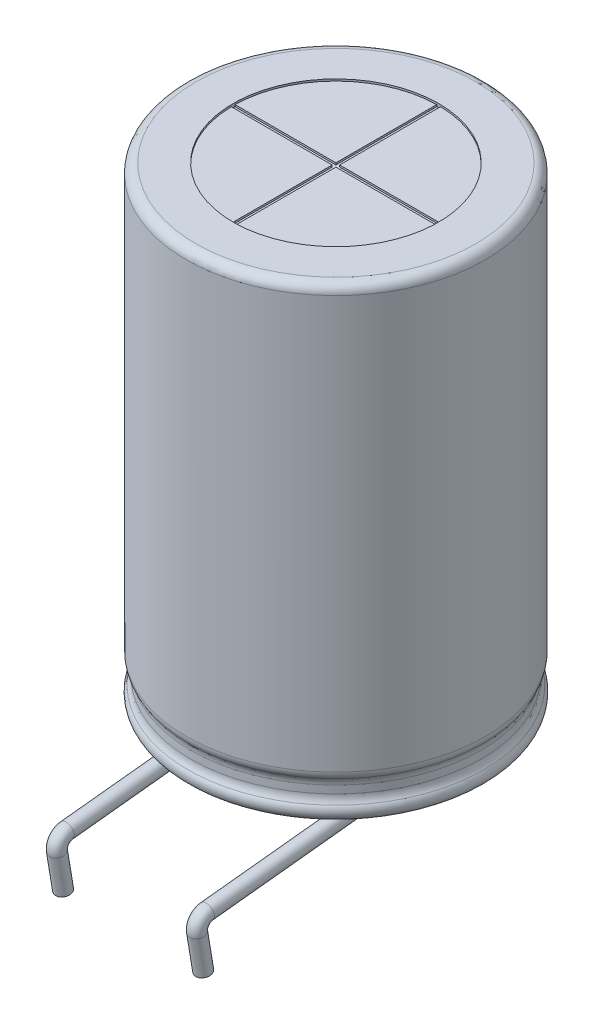
ISO-10303-21;
HEADER;
FILE_DESCRIPTION(('STEP AP214'),'2;1');
FILE_NAME('part.step','',(''),(''),'','','');
FILE_SCHEMA(('AUTOMOTIVE_DESIGN { 1 0 10303 214 1 1 1 1 }'));
ENDSEC;
DATA;
#1=APPLICATION_CONTEXT('core data for automotive mechanical design processes');
#2=APPLICATION_PROTOCOL_DEFINITION('international standard','automotive_design',2000,#1);
#3=PRODUCT_CONTEXT('',#1,'mechanical');
#4=PRODUCT('Part','Part','',(#3));
#5=PRODUCT_RELATED_PRODUCT_CATEGORY('part','',(#4));
#6=PRODUCT_DEFINITION_FORMATION('','',#4);
#7=PRODUCT_DEFINITION_CONTEXT('part definition',#1,'design');
#8=PRODUCT_DEFINITION('design','',#6,#7);
#9=PRODUCT_DEFINITION_SHAPE('','',#8);
#10=(LENGTH_UNIT() NAMED_UNIT(*) SI_UNIT(.MILLI.,.METRE.));
#11=(NAMED_UNIT(*) PLANE_ANGLE_UNIT() SI_UNIT($,.RADIAN.));
#12=(NAMED_UNIT(*) SI_UNIT($,.STERADIAN.) SOLID_ANGLE_UNIT());
#13=UNCERTAINTY_MEASURE_WITH_UNIT(LENGTH_MEASURE(1.E-05),#10,'distance_accuracy_value','');
#14=(GEOMETRIC_REPRESENTATION_CONTEXT(3) GLOBAL_UNCERTAINTY_ASSIGNED_CONTEXT((#13)) GLOBAL_UNIT_ASSIGNED_CONTEXT((#10,
#11,#12)) REPRESENTATION_CONTEXT('',''));
#15=CARTESIAN_POINT('',(0.,0.,0.));
#16=DIRECTION('',(0.,0.,1.));
#17=DIRECTION('',(1.,0.,0.));
#18=AXIS2_PLACEMENT_3D('',#15,#16,#17);
#19=CARTESIAN_POINT('',(0.,24.9,0.));
#20=DIRECTION('',(0.,-1.,0.));
#21=DIRECTION('',(0.,0.,-1.));
#22=AXIS2_PLACEMENT_3D('',#19,#20,#21);
#23=PLANE('',#22);
#24=CARTESIAN_POINT('',(0.,24.9,0.));
#25=DIRECTION('',(0.,1.,0.));
#26=DIRECTION('',(0.,0.,-1.));
#27=AXIS2_PLACEMENT_3D('',#24,#25,#26);
#28=CIRCLE('',#27,5.5);
#29=CARTESIAN_POINT('',(0.0999999999999808,24.9,5.499090833947));
#30=VERTEX_POINT('',#29);
#31=CARTESIAN_POINT('',(5.49909083394701,24.9,0.100000000000018));
#32=VERTEX_POINT('',#31);
#33=EDGE_CURVE('E153',#30,#32,#28,.T.);
#34=ORIENTED_EDGE('',*,*,#33,.T.);
#35=DIRECTION('',(1.,0.,0.));
#36=VECTOR('',#35,1.);
#37=CARTESIAN_POINT('',(0.100000000000001,24.9,0.0999999999999997));
#38=LINE('',#37,#36);
#39=CARTESIAN_POINT('',(0.100000000000001,24.9,0.0999999999999997));
#40=VERTEX_POINT('',#39);
#41=EDGE_CURVE('E197',#40,#32,#38,.T.);
#42=ORIENTED_EDGE('',*,*,#41,.F.);
#43=DIRECTION('',(0.,0.,-1.));
#44=VECTOR('',#43,1.);
#45=CARTESIAN_POINT('',(0.0999999999999823,24.9,5.499090833947));
#46=LINE('',#45,#44);
#47=EDGE_CURVE('E194',#30,#40,#46,.T.);
#48=ORIENTED_EDGE('',*,*,#47,.F.);
#49=EDGE_LOOP('',(#34,#42,#48));
#50=FACE_BOUND('',#49,.T.);
#51=ADVANCED_FACE('F41',(#50),#23,.F.);
#52=CARTESIAN_POINT('',(-5.499090833947,24.9,0.0999999999999632));
#53=VERTEX_POINT('',#52);
#54=CARTESIAN_POINT('',(-0.100000000000037,24.9,5.49909083394701));
#55=VERTEX_POINT('',#54);
#56=EDGE_CURVE('E235',#53,#55,#28,.T.);
#57=ORIENTED_EDGE('',*,*,#56,.T.);
#58=DIRECTION('',(0.,0.,1.));
#59=VECTOR('',#58,1.);
#60=CARTESIAN_POINT('',(-0.1,24.9,0.100000000000001));
#61=LINE('',#60,#59);
#62=CARTESIAN_POINT('',(-0.1,24.9,0.100000000000001));
#63=VERTEX_POINT('',#62);
#64=EDGE_CURVE('E190',#63,#55,#61,.T.);
#65=ORIENTED_EDGE('',*,*,#64,.F.);
#66=DIRECTION('',(1.,0.,0.));
#67=VECTOR('',#66,1.);
#68=CARTESIAN_POINT('',(-5.49909083394701,24.9,0.0999999999999631));
#69=LINE('',#68,#67);
#70=EDGE_CURVE('E186',#53,#63,#69,.T.);
#71=ORIENTED_EDGE('',*,*,#70,.F.);
#72=EDGE_LOOP('',(#57,#65,#71));
#73=FACE_BOUND('',#72,.T.);
#74=ADVANCED_FACE('F361',(#73),#23,.F.);
#75=CARTESIAN_POINT('',(-0.0999999999999423,24.9,-5.49909083394701));
#76=VERTEX_POINT('',#75);
#77=CARTESIAN_POINT('',(-5.49909083394701,24.9,-0.100000000000056));
#78=VERTEX_POINT('',#77);
#79=EDGE_CURVE('E230',#76,#78,#28,.T.);
#80=ORIENTED_EDGE('',*,*,#79,.T.);
#81=DIRECTION('',(-1.,0.,0.));
#82=VECTOR('',#81,1.);
#83=CARTESIAN_POINT('',(-0.1,24.9,-0.1));
#84=LINE('',#83,#82);
#85=CARTESIAN_POINT('',(-0.1,24.9,-0.1));
#86=VERTEX_POINT('',#85);
#87=EDGE_CURVE('E182',#86,#78,#84,.T.);
#88=ORIENTED_EDGE('',*,*,#87,.F.);
#89=DIRECTION('',(0.,0.,1.));
#90=VECTOR('',#89,1.);
#91=CARTESIAN_POINT('',(-0.0999999999999439,24.9,-5.49909083394701));
#92=LINE('',#91,#90);
#93=EDGE_CURVE('E178',#76,#86,#92,.T.);
#94=ORIENTED_EDGE('',*,*,#93,.F.);
#95=EDGE_LOOP('',(#80,#88,#94));
#96=FACE_BOUND('',#95,.T.);
#97=ADVANCED_FACE('F365',(#96),#23,.F.);
#98=CARTESIAN_POINT('',(0.,25.,0.));
#99=DIRECTION('',(0.,-1.,0.));
#100=DIRECTION('',(1.,0.,0.));
#101=AXIS2_PLACEMENT_3D('',#98,#99,#100);
#102=CYLINDRICAL_SURFACE('',#101,8.);
#103=CARTESIAN_POINT('',(0.,24.5,0.));
#104=DIRECTION('',(0.,1.,0.));
#105=DIRECTION('',(-1.,0.,0.));
#106=AXIS2_PLACEMENT_3D('',#103,#104,#105);
#107=CIRCLE('',#106,8.);
#108=CARTESIAN_POINT('',(-8.,24.5,0.));
#109=VERTEX_POINT('',#108);
#110=EDGE_CURVE('E255',#109,#109,#107,.F.);
#111=ORIENTED_EDGE('',*,*,#110,.T.);
#112=EDGE_LOOP('',(#111));
#113=FACE_BOUND('',#112,.T.);
#114=CARTESIAN_POINT('',(0.,2.40756880196224,0.));
#115=DIRECTION('',(0.,-1.,0.));
#116=DIRECTION('',(1.,0.,0.));
#117=AXIS2_PLACEMENT_3D('',#114,#115,#116);
#118=CIRCLE('',#117,8.);
#119=CARTESIAN_POINT('',(8.,2.40756880196224,0.));
#120=VERTEX_POINT('',#119);
#121=EDGE_CURVE('E234',#120,#120,#118,.T.);
#122=ORIENTED_EDGE('',*,*,#121,.F.);
#123=EDGE_LOOP('',(#122));
#124=FACE_BOUND('',#123,.T.);
#125=ADVANCED_FACE('F377',(#113,#124),#102,.T.);
#126=CARTESIAN_POINT('',(8.,25.,0.));
#127=DIRECTION('',(0.,1.,0.));
#128=DIRECTION('',(-1.,0.,0.));
#129=AXIS2_PLACEMENT_3D('',#126,#127,#128);
#130=PLANE('',#129);
#131=CARTESIAN_POINT('',(0.,25.,0.));
#132=DIRECTION('',(0.,1.,0.));
#133=DIRECTION('',(-1.,0.,0.));
#134=AXIS2_PLACEMENT_3D('',#131,#132,#133);
#135=CIRCLE('',#134,7.5);
#136=CARTESIAN_POINT('',(-7.5,25.,0.));
#137=VERTEX_POINT('',#136);
#138=EDGE_CURVE('E259',#137,#137,#135,.T.);
#139=ORIENTED_EDGE('',*,*,#138,.T.);
#140=EDGE_LOOP('',(#139));
#141=FACE_BOUND('',#140,.T.);
#142=CARTESIAN_POINT('',(0.,25.,0.));
#143=DIRECTION('',(0.,1.,0.));
#144=DIRECTION('',(0.,0.,-1.));
#145=AXIS2_PLACEMENT_3D('',#142,#143,#144);
#146=CIRCLE('',#145,5.5);
#147=CARTESIAN_POINT('',(0.,25.,-5.5));
#148=VERTEX_POINT('',#147);
#149=EDGE_CURVE('E202',#148,#148,#146,.T.);
#150=ORIENTED_EDGE('',*,*,#149,.F.);
#151=EDGE_LOOP('',(#150));
#152=FACE_BOUND('',#151,.T.);
#153=ADVANCED_FACE('F382',(#141,#152),#130,.T.);
#154=CARTESIAN_POINT('',(0.,0.,0.));
#155=DIRECTION('',(0.,-1.,0.));
#156=DIRECTION('',(1.,0.,0.));
#157=AXIS2_PLACEMENT_3D('',#154,#155,#156);
#158=PLANE('',#157);
#159=CARTESIAN_POINT('',(0.,0.,0.));
#160=DIRECTION('',(0.,-1.,0.));
#161=DIRECTION('',(1.,0.,0.));
#162=AXIS2_PLACEMENT_3D('',#159,#160,#161);
#163=CIRCLE('',#162,7.51793220524762);
#164=CARTESIAN_POINT('',(7.51793220524762,0.,0.));
#165=VERTEX_POINT('',#164);
#166=EDGE_CURVE('E263',#165,#165,#163,.T.);
#167=ORIENTED_EDGE('',*,*,#166,.T.);
#168=EDGE_LOOP('',(#167));
#169=FACE_BOUND('',#168,.T.);
#170=CARTESIAN_POINT('',(0.,0.,0.));
#171=DIRECTION('',(0.,-1.,0.));
#172=DIRECTION('',(1.,0.,0.));
#173=AXIS2_PLACEMENT_3D('',#170,#171,#172);
#174=CIRCLE('',#173,5.5);
#175=CARTESIAN_POINT('',(5.5,0.,0.));
#176=VERTEX_POINT('',#175);
#177=EDGE_CURVE('E287',#176,#176,#174,.T.);
#178=ORIENTED_EDGE('',*,*,#177,.F.);
#179=EDGE_LOOP('',(#178));
#180=FACE_BOUND('',#179,.T.);
#181=ADVANCED_FACE('F637',(#169,#180),#158,.T.);
#182=CARTESIAN_POINT('',(0.,1.23259900370742,0.));
#183=DIRECTION('',(0.,-1.,0.));
#184=DIRECTION('',(1.,0.,0.));
#185=AXIS2_PLACEMENT_3D('',#182,#183,#184);
#186=TOROIDAL_SURFACE('',#185,8.43125,0.670833333333331);
#187=CARTESIAN_POINT('',(0.,0.812853667063678,0.));
#188=DIRECTION('',(0.,1.,0.));
#189=DIRECTION('',(-1.,0.,0.));
#190=AXIS2_PLACEMENT_3D('',#187,#188,#189);
#191=CIRCLE('',#190,7.90796115674331);
#192=CARTESIAN_POINT('',(-7.90796115674331,0.812853667063677,0.));
#193=VERTEX_POINT('',#192);
#194=EDGE_CURVE('E267',#193,#193,#191,.T.);
#195=ORIENTED_EDGE('',*,*,#194,.T.);
#196=EDGE_LOOP('',(#195));
#197=FACE_BOUND('',#196,.T.);
#198=CARTESIAN_POINT('',(0.,1.23259900370742,0.));
#199=DIRECTION('',(0.,-1.,0.));
#200=DIRECTION('',(1.,0.,0.));
#201=AXIS2_PLACEMENT_3D('',#198,#199,#200);
#202=CIRCLE('',#201,7.76041666666666);
#203=CARTESIAN_POINT('',(7.76041666666666,1.23259900370742,0.));
#204=VERTEX_POINT('',#203);
#205=EDGE_CURVE('E251',#204,#204,#202,.T.);
#206=ORIENTED_EDGE('',*,*,#205,.T.);
#207=EDGE_LOOP('',(#206));
#208=FACE_BOUND('',#207,.T.);
#209=ADVANCED_FACE('F631',(#197,#208),#186,.F.);
#210=CARTESIAN_POINT('',(0.,25.,0.));
#211=DIRECTION('',(0.,-1.,0.));
#212=DIRECTION('',(1.,0.,0.));
#213=AXIS2_PLACEMENT_3D('',#210,#211,#212);
#214=CYLINDRICAL_SURFACE('',#213,7.76041666666666);
#215=CARTESIAN_POINT('',(0.,1.64240099629257,0.));
#216=DIRECTION('',(0.,-1.,0.));
#217=DIRECTION('',(1.,0.,0.));
#218=AXIS2_PLACEMENT_3D('',#215,#216,#217);
#219=CIRCLE('',#218,7.76041666666667);
#220=CARTESIAN_POINT('',(7.76041666666667,1.64240099629258,0.));
#221=VERTEX_POINT('',#220);
#222=EDGE_CURVE('E247',#221,#221,#219,.T.);
#223=ORIENTED_EDGE('',*,*,#222,.T.);
#224=EDGE_LOOP('',(#223));
#225=FACE_BOUND('',#224,.T.);
#226=ORIENTED_EDGE('',*,*,#205,.F.);
#227=EDGE_LOOP('',(#226));
#228=FACE_BOUND('',#227,.T.);
#229=ADVANCED_FACE('F636',(#225,#228),#214,.T.);
#230=CARTESIAN_POINT('',(0.,1.64240099629258,0.));
#231=DIRECTION('',(0.,-1.,0.));
#232=DIRECTION('',(1.,0.,0.));
#233=AXIS2_PLACEMENT_3D('',#230,#231,#232);
#234=TOROIDAL_SURFACE('',#233,8.43125,0.670833333333334);
#235=CARTESIAN_POINT('',(0.,2.02498489912741,0.));
#236=DIRECTION('',(0.,-1.,0.));
#237=DIRECTION('',(1.,0.,0.));
#238=AXIS2_PLACEMENT_3D('',#235,#236,#237);
#239=CIRCLE('',#238,7.88020833333333);
#240=CARTESIAN_POINT('',(7.88020833333333,2.02498489912741,0.));
#241=VERTEX_POINT('',#240);
#242=EDGE_CURVE('E243',#241,#241,#239,.T.);
#243=ORIENTED_EDGE('',*,*,#242,.T.);
#244=EDGE_LOOP('',(#243));
#245=FACE_BOUND('',#244,.T.);
#246=ORIENTED_EDGE('',*,*,#222,.F.);
#247=EDGE_LOOP('',(#246));
#248=FACE_BOUND('',#247,.T.);
#249=ADVANCED_FACE('F755',(#245,#248),#234,.F.);
#250=CARTESIAN_POINT('',(0.,2.40756880196224,0.));
#251=DIRECTION('',(0.,-1.,0.));
#252=DIRECTION('',(1.,0.,0.));
#253=AXIS2_PLACEMENT_3D('',#250,#251,#252);
#254=TOROIDAL_SURFACE('',#253,7.32916666666666,0.670833333333332);
#255=ORIENTED_EDGE('',*,*,#121,.T.);
#256=EDGE_LOOP('',(#255));
#257=FACE_BOUND('',#256,.T.);
#258=ORIENTED_EDGE('',*,*,#242,.F.);
#259=EDGE_LOOP('',(#258));
#260=FACE_BOUND('',#259,.T.);
#261=ADVANCED_FACE('F375',(#257,#260),#254,.T.);
#262=CARTESIAN_POINT('',(0.,24.9,0.));
#263=DIRECTION('',(0.,1.,0.));
#264=DIRECTION('',(0.,0.,1.));
#265=AXIS2_PLACEMENT_3D('',#262,#263,#264);
#266=CYLINDRICAL_SURFACE('',#265,5.5);
#267=ORIENTED_EDGE('',*,*,#79,.F.);
#268=DIRECTION('',(0.,1.,0.));
#269=VECTOR('',#268,1.);
#270=CARTESIAN_POINT('',(-0.0999999999999423,24.8,-5.49909083394701));
#271=LINE('',#270,#269);
#272=CARTESIAN_POINT('',(-0.0999999999999423,24.8,-5.49909083394701));
#273=VERTEX_POINT('',#272);
#274=EDGE_CURVE('E219',#273,#76,#271,.T.);
#275=ORIENTED_EDGE('',*,*,#274,.F.);
#276=CARTESIAN_POINT('',(0.,24.8,0.));
#277=DIRECTION('',(0.,1.,0.));
#278=DIRECTION('',(0.,0.,1.));
#279=AXIS2_PLACEMENT_3D('',#276,#277,#278);
#280=CIRCLE('',#279,5.5);
#281=CARTESIAN_POINT('',(0.0999999999999986,24.8,-5.49909083394701));
#282=VERTEX_POINT('',#281);
#283=EDGE_CURVE('E306',#282,#273,#280,.T.);
#284=ORIENTED_EDGE('',*,*,#283,.F.);
#285=DIRECTION('',(0.,1.,0.));
#286=VECTOR('',#285,1.);
#287=CARTESIAN_POINT('',(0.0999999999999986,24.8,-5.49909083394701));
#288=LINE('',#287,#286);
#289=CARTESIAN_POINT('',(0.0999999999999986,24.9,-5.49909083394701));
#290=VERTEX_POINT('',#289);
#291=EDGE_CURVE('E222',#282,#290,#288,.T.);
#292=ORIENTED_EDGE('',*,*,#291,.T.);
#293=CARTESIAN_POINT('',(5.499090833947,24.9,-0.100000000000002));
#294=VERTEX_POINT('',#293);
#295=EDGE_CURVE('E236',#294,#290,#28,.T.);
#296=ORIENTED_EDGE('',*,*,#295,.F.);
#297=DIRECTION('',(0.,1.,0.));
#298=VECTOR('',#297,1.);
#299=CARTESIAN_POINT('',(5.499090833947,24.8,-0.100000000000002));
#300=LINE('',#299,#298);
#301=CARTESIAN_POINT('',(5.499090833947,24.8,-0.100000000000002));
#302=VERTEX_POINT('',#301);
#303=EDGE_CURVE('E57',#302,#294,#300,.T.);
#304=ORIENTED_EDGE('',*,*,#303,.F.);
#305=CARTESIAN_POINT('',(0.,24.8,0.));
#306=DIRECTION('',(0.,1.,0.));
#307=DIRECTION('',(0.,0.,1.));
#308=AXIS2_PLACEMENT_3D('',#305,#306,#307);
#309=CIRCLE('',#308,5.5);
#310=CARTESIAN_POINT('',(5.49909083394701,24.8,0.100000000000018));
#311=VERTEX_POINT('',#310);
#312=EDGE_CURVE('E65',#311,#302,#309,.T.);
#313=ORIENTED_EDGE('',*,*,#312,.F.);
#314=DIRECTION('',(0.,1.,0.));
#315=VECTOR('',#314,1.);
#316=CARTESIAN_POINT('',(5.49909083394701,24.8,0.100000000000018));
#317=LINE('',#316,#315);
#318=EDGE_CURVE('E104',#311,#32,#317,.T.);
#319=ORIENTED_EDGE('',*,*,#318,.T.);
#320=ORIENTED_EDGE('',*,*,#33,.F.);
#321=DIRECTION('',(0.,1.,0.));
#322=VECTOR('',#321,1.);
#323=CARTESIAN_POINT('',(0.0999999999999808,24.8,5.499090833947));
#324=LINE('',#323,#322);
#325=CARTESIAN_POINT('',(0.0999999999999808,24.8,5.499090833947));
#326=VERTEX_POINT('',#325);
#327=EDGE_CURVE('E148',#326,#30,#324,.T.);
#328=ORIENTED_EDGE('',*,*,#327,.F.);
#329=CARTESIAN_POINT('',(0.,24.8,0.));
#330=DIRECTION('',(0.,1.,0.));
#331=DIRECTION('',(0.,0.,1.));
#332=AXIS2_PLACEMENT_3D('',#329,#330,#331);
#333=CIRCLE('',#332,5.5);
#334=CARTESIAN_POINT('',(-0.100000000000037,24.8,5.49909083394701));
#335=VERTEX_POINT('',#334);
#336=EDGE_CURVE('E137',#335,#326,#333,.T.);
#337=ORIENTED_EDGE('',*,*,#336,.F.);
#338=DIRECTION('',(0.,1.,0.));
#339=VECTOR('',#338,1.);
#340=CARTESIAN_POINT('',(-0.100000000000037,24.8,5.49909083394701));
#341=LINE('',#340,#339);
#342=EDGE_CURVE('E159',#335,#55,#341,.T.);
#343=ORIENTED_EDGE('',*,*,#342,.T.);
#344=ORIENTED_EDGE('',*,*,#56,.F.);
#345=DIRECTION('',(0.,1.,0.));
#346=VECTOR('',#345,1.);
#347=CARTESIAN_POINT('',(-5.499090833947,24.8,0.0999999999999632));
#348=LINE('',#347,#346);
#349=CARTESIAN_POINT('',(-5.499090833947,24.8,0.0999999999999632));
#350=VERTEX_POINT('',#349);
#351=EDGE_CURVE('E210',#350,#53,#348,.T.);
#352=ORIENTED_EDGE('',*,*,#351,.F.);
#353=CARTESIAN_POINT('',(0.,24.8,0.));
#354=DIRECTION('',(0.,1.,0.));
#355=DIRECTION('',(0.,0.,1.));
#356=AXIS2_PLACEMENT_3D('',#353,#354,#355);
#357=CIRCLE('',#356,5.49999999999999);
#358=CARTESIAN_POINT('',(-5.49909083394701,24.8,-0.100000000000056));
#359=VERTEX_POINT('',#358);
#360=EDGE_CURVE('E317',#359,#350,#357,.T.);
#361=ORIENTED_EDGE('',*,*,#360,.F.);
#362=DIRECTION('',(0.,1.,0.));
#363=VECTOR('',#362,1.);
#364=CARTESIAN_POINT('',(-5.49909083394701,24.8,-0.100000000000056));
#365=LINE('',#364,#363);
#366=EDGE_CURVE('E213',#359,#78,#365,.T.);
#367=ORIENTED_EDGE('',*,*,#366,.T.);
#368=EDGE_LOOP('',(#267,#275,#284,#292,#296,#304,#313,#319,#320,#328,#337,#343,#344,#352,#361,#367));
#369=FACE_BOUND('',#368,.T.);
#370=ORIENTED_EDGE('',*,*,#149,.T.);
#371=EDGE_LOOP('',(#370));
#372=FACE_BOUND('',#371,.T.);
#373=ADVANCED_FACE('F150',(#369,#372),#266,.F.);
#374=ORIENTED_EDGE('',*,*,#295,.T.);
#375=DIRECTION('',(0.,0.,-1.));
#376=VECTOR('',#375,1.);
#377=CARTESIAN_POINT('',(0.0999999999999994,24.9,-0.100000000000002));
#378=LINE('',#377,#376);
#379=CARTESIAN_POINT('',(0.0999999999999994,24.9,-0.100000000000002));
#380=VERTEX_POINT('',#379);
#381=EDGE_CURVE('E173',#380,#290,#378,.T.);
#382=ORIENTED_EDGE('',*,*,#381,.F.);
#383=DIRECTION('',(-1.,0.,0.));
#384=VECTOR('',#383,1.);
#385=CARTESIAN_POINT('',(5.499090833947,24.9,-0.100000000000002));
#386=LINE('',#385,#384);
#387=EDGE_CURVE('E170',#294,#380,#386,.T.);
#388=ORIENTED_EDGE('',*,*,#387,.F.);
#389=EDGE_LOOP('',(#374,#382,#388));
#390=FACE_BOUND('',#389,.T.);
#391=ADVANCED_FACE('F343',(#390),#23,.F.);
#392=CARTESIAN_POINT('',(0.100000000000001,24.8,0.0999999999999997));
#393=DIRECTION('',(0.,0.,1.));
#394=DIRECTION('',(1.,0.,0.));
#395=AXIS2_PLACEMENT_3D('',#392,#393,#394);
#396=PLANE('',#395);
#397=ORIENTED_EDGE('',*,*,#41,.T.);
#398=ORIENTED_EDGE('',*,*,#318,.F.);
#399=DIRECTION('',(1.,0.,0.));
#400=VECTOR('',#399,1.);
#401=CARTESIAN_POINT('',(0.100000000000001,24.8,0.0999999999999997));
#402=LINE('',#401,#400);
#403=CARTESIAN_POINT('',(0.100000000000001,24.8,0.0999999999999997));
#404=VERTEX_POINT('',#403);
#405=EDGE_CURVE('E164',#404,#311,#402,.T.);
#406=ORIENTED_EDGE('',*,*,#405,.F.);
#407=DIRECTION('',(0.,1.,0.));
#408=VECTOR('',#407,1.);
#409=CARTESIAN_POINT('',(0.100000000000001,24.8,0.0999999999999997));
#410=LINE('',#409,#408);
#411=EDGE_CURVE('E158',#404,#40,#410,.T.);
#412=ORIENTED_EDGE('',*,*,#411,.T.);
#413=EDGE_LOOP('',(#397,#398,#406,#412));
#414=FACE_BOUND('',#413,.T.);
#415=ADVANCED_FACE('F368',(#414),#396,.F.);
#416=CARTESIAN_POINT('',(0.0999999999999823,24.8,5.499090833947));
#417=DIRECTION('',(1.,0.,0.));
#418=DIRECTION('',(0.,0.,-1.));
#419=AXIS2_PLACEMENT_3D('',#416,#417,#418);
#420=PLANE('',#419);
#421=ORIENTED_EDGE('',*,*,#47,.T.);
#422=ORIENTED_EDGE('',*,*,#411,.F.);
#423=DIRECTION('',(0.,0.,-1.));
#424=VECTOR('',#423,1.);
#425=CARTESIAN_POINT('',(0.0999999999999823,24.8,5.499090833947));
#426=LINE('',#425,#424);
#427=EDGE_CURVE('E142',#326,#404,#426,.T.);
#428=ORIENTED_EDGE('',*,*,#427,.F.);
#429=ORIENTED_EDGE('',*,*,#327,.T.);
#430=EDGE_LOOP('',(#421,#422,#428,#429));
#431=FACE_BOUND('',#430,.T.);
#432=ADVANCED_FACE('F161',(#431),#420,.F.);
#433=CARTESIAN_POINT('',(-0.1,24.8,0.100000000000001));
#434=DIRECTION('',(-1.,0.,0.));
#435=DIRECTION('',(0.,0.,1.));
#436=AXIS2_PLACEMENT_3D('',#433,#434,#435);
#437=PLANE('',#436);
#438=ORIENTED_EDGE('',*,*,#64,.T.);
#439=ORIENTED_EDGE('',*,*,#342,.F.);
#440=DIRECTION('',(0.,0.,1.));
#441=VECTOR('',#440,1.);
#442=CARTESIAN_POINT('',(-0.1,24.8,0.100000000000001));
#443=LINE('',#442,#441);
#444=CARTESIAN_POINT('',(-0.1,24.8,0.100000000000001));
#445=VERTEX_POINT('',#444);
#446=EDGE_CURVE('E145',#445,#335,#443,.T.);
#447=ORIENTED_EDGE('',*,*,#446,.F.);
#448=DIRECTION('',(0.,1.,0.));
#449=VECTOR('',#448,1.);
#450=CARTESIAN_POINT('',(-0.1,24.8,0.100000000000001));
#451=LINE('',#450,#449);
#452=EDGE_CURVE('E207',#445,#63,#451,.T.);
#453=ORIENTED_EDGE('',*,*,#452,.T.);
#454=EDGE_LOOP('',(#438,#439,#447,#453));
#455=FACE_BOUND('',#454,.T.);
#456=ADVANCED_FACE('F331',(#455),#437,.F.);
#457=CARTESIAN_POINT('',(-5.49909083394701,24.8,0.0999999999999631));
#458=DIRECTION('',(0.,0.,1.));
#459=DIRECTION('',(1.,0.,0.));
#460=AXIS2_PLACEMENT_3D('',#457,#458,#459);
#461=PLANE('',#460);
#462=ORIENTED_EDGE('',*,*,#70,.T.);
#463=ORIENTED_EDGE('',*,*,#452,.F.);
#464=DIRECTION('',(1.,0.,0.));
#465=VECTOR('',#464,1.);
#466=CARTESIAN_POINT('',(-5.49909083394701,24.8,0.0999999999999631));
#467=LINE('',#466,#465);
#468=EDGE_CURVE('E320',#350,#445,#467,.T.);
#469=ORIENTED_EDGE('',*,*,#468,.F.);
#470=ORIENTED_EDGE('',*,*,#351,.T.);
#471=EDGE_LOOP('',(#462,#463,#469,#470));
#472=FACE_BOUND('',#471,.T.);
#473=ADVANCED_FACE('F327',(#472),#461,.F.);
#474=CARTESIAN_POINT('',(-0.1,24.8,-0.1));
#475=DIRECTION('',(0.,0.,-1.));
#476=DIRECTION('',(-1.,0.,0.));
#477=AXIS2_PLACEMENT_3D('',#474,#475,#476);
#478=PLANE('',#477);
#479=ORIENTED_EDGE('',*,*,#87,.T.);
#480=ORIENTED_EDGE('',*,*,#366,.F.);
#481=DIRECTION('',(-1.,0.,0.));
#482=VECTOR('',#481,1.);
#483=CARTESIAN_POINT('',(-0.1,24.8,-0.1));
#484=LINE('',#483,#482);
#485=CARTESIAN_POINT('',(-0.1,24.8,-0.1));
#486=VERTEX_POINT('',#485);
#487=EDGE_CURVE('E313',#486,#359,#484,.T.);
#488=ORIENTED_EDGE('',*,*,#487,.F.);
#489=DIRECTION('',(0.,1.,0.));
#490=VECTOR('',#489,1.);
#491=CARTESIAN_POINT('',(-0.1,24.8,-0.1));
#492=LINE('',#491,#490);
#493=EDGE_CURVE('E216',#486,#86,#492,.T.);
#494=ORIENTED_EDGE('',*,*,#493,.T.);
#495=EDGE_LOOP('',(#479,#480,#488,#494));
#496=FACE_BOUND('',#495,.T.);
#497=ADVANCED_FACE('F390',(#496),#478,.F.);
#498=CARTESIAN_POINT('',(-0.0999999999999439,24.8,-5.49909083394701));
#499=DIRECTION('',(-1.,0.,0.));
#500=DIRECTION('',(0.,0.,1.));
#501=AXIS2_PLACEMENT_3D('',#498,#499,#500);
#502=PLANE('',#501);
#503=ORIENTED_EDGE('',*,*,#93,.T.);
#504=ORIENTED_EDGE('',*,*,#493,.F.);
#505=DIRECTION('',(0.,0.,1.));
#506=VECTOR('',#505,1.);
#507=CARTESIAN_POINT('',(-0.0999999999999439,24.8,-5.49909083394701));
#508=LINE('',#507,#506);
#509=EDGE_CURVE('E309',#273,#486,#508,.T.);
#510=ORIENTED_EDGE('',*,*,#509,.F.);
#511=ORIENTED_EDGE('',*,*,#274,.T.);
#512=EDGE_LOOP('',(#503,#504,#510,#511));
#513=FACE_BOUND('',#512,.T.);
#514=ADVANCED_FACE('F357',(#513),#502,.F.);
#515=CARTESIAN_POINT('',(0.0999999999999994,24.8,-0.100000000000002));
#516=DIRECTION('',(1.,0.,0.));
#517=DIRECTION('',(0.,0.,-1.));
#518=AXIS2_PLACEMENT_3D('',#515,#516,#517);
#519=PLANE('',#518);
#520=ORIENTED_EDGE('',*,*,#381,.T.);
#521=ORIENTED_EDGE('',*,*,#291,.F.);
#522=DIRECTION('',(0.,0.,-1.));
#523=VECTOR('',#522,1.);
#524=CARTESIAN_POINT('',(0.0999999999999994,24.8,-0.100000000000002));
#525=LINE('',#524,#523);
#526=CARTESIAN_POINT('',(0.0999999999999994,24.8,-0.100000000000002));
#527=VERTEX_POINT('',#526);
#528=EDGE_CURVE('E302',#527,#282,#525,.T.);
#529=ORIENTED_EDGE('',*,*,#528,.F.);
#530=DIRECTION('',(0.,1.,0.));
#531=VECTOR('',#530,1.);
#532=CARTESIAN_POINT('',(0.0999999999999994,24.8,-0.100000000000002));
#533=LINE('',#532,#531);
#534=EDGE_CURVE('E225',#527,#380,#533,.T.);
#535=ORIENTED_EDGE('',*,*,#534,.T.);
#536=EDGE_LOOP('',(#520,#521,#529,#535));
#537=FACE_BOUND('',#536,.T.);
#538=ADVANCED_FACE('F348',(#537),#519,.F.);
#539=CARTESIAN_POINT('',(5.499090833947,24.8,-0.100000000000002));
#540=DIRECTION('',(0.,0.,-1.));
#541=DIRECTION('',(-1.,0.,0.));
#542=AXIS2_PLACEMENT_3D('',#539,#540,#541);
#543=PLANE('',#542);
#544=ORIENTED_EDGE('',*,*,#387,.T.);
#545=ORIENTED_EDGE('',*,*,#534,.F.);
#546=DIRECTION('',(-1.,0.,0.));
#547=VECTOR('',#546,1.);
#548=CARTESIAN_POINT('',(5.499090833947,24.8,-0.100000000000002));
#549=LINE('',#548,#547);
#550=EDGE_CURVE('E298',#302,#527,#549,.T.);
#551=ORIENTED_EDGE('',*,*,#550,.F.);
#552=ORIENTED_EDGE('',*,*,#303,.T.);
#553=EDGE_LOOP('',(#544,#545,#551,#552));
#554=FACE_BOUND('',#553,.T.);
#555=ADVANCED_FACE('F349',(#554),#543,.F.);
#556=CARTESIAN_POINT('',(0.,24.8,0.));
#557=DIRECTION('',(0.,1.,0.));
#558=DIRECTION('',(0.,0.,1.));
#559=AXIS2_PLACEMENT_3D('',#556,#557,#558);
#560=PLANE('',#559);
#561=ORIENTED_EDGE('',*,*,#312,.T.);
#562=ORIENTED_EDGE('',*,*,#550,.T.);
#563=ORIENTED_EDGE('',*,*,#528,.T.);
#564=ORIENTED_EDGE('',*,*,#283,.T.);
#565=ORIENTED_EDGE('',*,*,#509,.T.);
#566=ORIENTED_EDGE('',*,*,#487,.T.);
#567=ORIENTED_EDGE('',*,*,#360,.T.);
#568=ORIENTED_EDGE('',*,*,#468,.T.);
#569=ORIENTED_EDGE('',*,*,#446,.T.);
#570=ORIENTED_EDGE('',*,*,#336,.T.);
#571=ORIENTED_EDGE('',*,*,#427,.T.);
#572=ORIENTED_EDGE('',*,*,#405,.T.);
#573=EDGE_LOOP('',(#561,#562,#563,#564,#565,#566,#567,#568,#569,#570,#571,#572));
#574=FACE_BOUND('',#573,.T.);
#575=ADVANCED_FACE('F139',(#574),#560,.T.);
#576=CARTESIAN_POINT('',(0.,0.25,0.));
#577=DIRECTION('',(0.,-1.,0.));
#578=DIRECTION('',(1.,0.,0.));
#579=AXIS2_PLACEMENT_3D('',#576,#577,#578);
#580=CYLINDRICAL_SURFACE('',#579,5.5);
#581=CARTESIAN_POINT('',(0.,0.25,0.));
#582=DIRECTION('',(0.,-1.,0.));
#583=DIRECTION('',(1.,0.,0.));
#584=AXIS2_PLACEMENT_3D('',#581,#582,#583);
#585=CIRCLE('',#584,5.5);
#586=CARTESIAN_POINT('',(5.5,0.250000000000001,0.));
#587=VERTEX_POINT('',#586);
#588=EDGE_CURVE('E174',#587,#587,#585,.T.);
#589=ORIENTED_EDGE('',*,*,#588,.F.);
#590=EDGE_LOOP('',(#589));
#591=FACE_BOUND('',#590,.T.);
#592=ORIENTED_EDGE('',*,*,#177,.T.);
#593=EDGE_LOOP('',(#592));
#594=FACE_BOUND('',#593,.T.);
#595=ADVANCED_FACE('F280',(#591,#594),#580,.F.);
#596=CARTESIAN_POINT('',(0.,0.25,0.));
#597=DIRECTION('',(0.,-1.,0.));
#598=DIRECTION('',(1.,0.,0.));
#599=AXIS2_PLACEMENT_3D('',#596,#597,#598);
#600=PLANE('',#599);
#601=CARTESIAN_POINT('',(-3.75,0.25,0.));
#602=DIRECTION('',(0.,-1.,0.));
#603=DIRECTION('',(1.,0.,0.));
#604=AXIS2_PLACEMENT_3D('',#601,#602,#603);
#605=CIRCLE('',#604,0.4);
#606=CARTESIAN_POINT('',(-3.35,0.25,0.));
#607=VERTEX_POINT('',#606);
#608=EDGE_CURVE('E11',#607,#607,#605,.T.);
#609=ORIENTED_EDGE('',*,*,#608,.F.);
#610=EDGE_LOOP('',(#609));
#611=FACE_BOUND('',#610,.T.);
#612=CARTESIAN_POINT('',(3.75,0.25,0.));
#613=DIRECTION('',(0.,-1.,0.));
#614=DIRECTION('',(1.,0.,0.));
#615=AXIS2_PLACEMENT_3D('',#612,#613,#614);
#616=CIRCLE('',#615,0.4);
#617=CARTESIAN_POINT('',(4.15,0.25,0.));
#618=VERTEX_POINT('',#617);
#619=EDGE_CURVE('E50',#618,#618,#616,.T.);
#620=ORIENTED_EDGE('',*,*,#619,.F.);
#621=EDGE_LOOP('',(#620));
#622=FACE_BOUND('',#621,.T.);
#623=ORIENTED_EDGE('',*,*,#588,.T.);
#624=EDGE_LOOP('',(#623));
#625=FACE_BOUND('',#624,.T.);
#626=ADVANCED_FACE('F276',(#611,#622,#625),#600,.T.);
#627=CARTESIAN_POINT('',(0.,24.5,0.));
#628=DIRECTION('',(0.,1.,0.));
#629=DIRECTION('',(-1.,0.,0.));
#630=AXIS2_PLACEMENT_3D('',#627,#628,#629);
#631=TOROIDAL_SURFACE('',#630,7.5,0.5);
#632=ORIENTED_EDGE('',*,*,#138,.F.);
#633=EDGE_LOOP('',(#632));
#634=FACE_BOUND('',#633,.T.);
#635=ORIENTED_EDGE('',*,*,#110,.F.);
#636=EDGE_LOOP('',(#635));
#637=FACE_BOUND('',#636,.T.);
#638=ADVANCED_FACE('F279',(#634,#637),#631,.T.);
#639=CARTESIAN_POINT('',(0.,0.499999999999999,0.));
#640=DIRECTION('',(0.,1.,0.));
#641=DIRECTION('',(-1.,0.,0.));
#642=AXIS2_PLACEMENT_3D('',#639,#640,#641);
#643=TOROIDAL_SURFACE('',#642,7.51793220524762,0.5);
#644=ORIENTED_EDGE('',*,*,#194,.F.);
#645=EDGE_LOOP('',(#644));
#646=FACE_BOUND('',#645,.T.);
#647=ORIENTED_EDGE('',*,*,#166,.F.);
#648=EDGE_LOOP('',(#647));
#649=FACE_BOUND('',#648,.T.);
#650=ADVANCED_FACE('F43',(#646,#649),#643,.T.);
#651=CARTESIAN_POINT('',(3.75,-5.15616277952463,10.8508698919982));
#652=DIRECTION('',(0.,-0.986438339744518,-0.164132269472154));
#653=DIRECTION('',(1.,0.,0.));
#654=AXIS2_PLACEMENT_3D('',#651,#652,#653);
#655=PLANE('',#654);
#656=CARTESIAN_POINT('',(3.75,-5.15616277952463,10.8508698919982));
#657=DIRECTION('',(0.,-0.986438339744518,-0.164132269472154));
#658=DIRECTION('',(1.,0.,0.));
#659=AXIS2_PLACEMENT_3D('',#656,#657,#658);
#660=CIRCLE('',#659,0.4);
#661=CARTESIAN_POINT('',(4.15,-5.15616277952463,10.8508698919982));
#662=VERTEX_POINT('',#661);
#663=EDGE_CURVE('E291',#662,#662,#660,.T.);
#664=ORIENTED_EDGE('',*,*,#663,.T.);
#665=EDGE_LOOP('',(#664));
#666=FACE_BOUND('',#665,.T.);
#667=ADVANCED_FACE('F407',(#666),#655,.T.);
#668=CARTESIAN_POINT('',(3.75,0.25,0.));
#669=DIRECTION('',(0.,-1.,0.));
#670=DIRECTION('',(0.,0.,-1.));
#671=AXIS2_PLACEMENT_3D('',#668,#669,#670);
#672=CYLINDRICAL_SURFACE('',#671,0.4);
#673=CARTESIAN_POINT('',(3.75,0.,0.));
#674=DIRECTION('',(0.,-1.,0.));
#675=DIRECTION('',(1.,0.,0.));
#676=AXIS2_PLACEMENT_3D('',#673,#674,#675);
#677=CIRCLE('',#676,0.4);
#678=CARTESIAN_POINT('',(3.75,0.,-0.400000000000003));
#679=VERTEX_POINT('',#678);
#680=EDGE_CURVE('E480',#679,#679,#677,.T.);
#681=ORIENTED_EDGE('',*,*,#680,.F.);
#682=EDGE_LOOP('',(#681));
#683=FACE_BOUND('',#682,.T.);
#684=ORIENTED_EDGE('',*,*,#619,.T.);
#685=EDGE_LOOP('',(#684));
#686=FACE_BOUND('',#685,.T.);
#687=ADVANCED_FACE('F274',(#683,#686),#672,.T.);
#688=CARTESIAN_POINT('',(3.75,0.,1.5));
#689=DIRECTION('',(-1.,0.,0.));
#690=DIRECTION('',(0.,0.,1.));
#691=AXIS2_PLACEMENT_3D('',#688,#689,#690);
#692=TOROIDAL_SURFACE('',#691,1.5,0.4);
#693=CARTESIAN_POINT('',(3.75,-1.4914781249483,1.34033471635729));
#694=DIRECTION('',(0.,-0.10644352242847,0.994318749965533));
#695=DIRECTION('',(1.,0.,0.));
#696=AXIS2_PLACEMENT_3D('',#693,#694,#695);
#697=CIRCLE('',#696,0.4);
#698=CARTESIAN_POINT('',(3.75,-1.88920562493452,1.29775730738591));
#699=VERTEX_POINT('',#698);
#700=EDGE_CURVE('E484',#699,#699,#697,.T.);
#701=CARTESIAN_POINT('',(3.75,0.,1.5));
#702=DIRECTION('',(-1.,0.,0.));
#703=DIRECTION('',(0.,0.,1.));
#704=AXIS2_PLACEMENT_3D('',#701,#702,#703);
#705=CIRCLE('',#704,1.9);
#706=EDGE_CURVE('',#679,#699,#705,.T.);
#707=ORIENTED_EDGE('',*,*,#680,.T.);
#708=ORIENTED_EDGE('',*,*,#700,.F.);
#709=ORIENTED_EDGE('',*,*,#706,.T.);
#710=ORIENTED_EDGE('',*,*,#706,.F.);
#711=EDGE_LOOP('',(#707,#709,#708,#710));
#712=FACE_BOUND('',#711,.T.);
#713=ADVANCED_FACE('F424',(#712),#692,.T.);
#714=CARTESIAN_POINT('',(3.75,-1.4914781249483,1.34033471635729));
#715=DIRECTION('',(0.,-0.106443522428474,0.994318749965532));
#716=DIRECTION('',(0.,-0.994318749965532,-0.106443522428474));
#717=AXIS2_PLACEMENT_3D('',#714,#715,#716);
#718=CYLINDRICAL_SURFACE('',#717,0.4);
#719=CARTESIAN_POINT('',(3.75,-2.48821548837298,10.6511375405529));
#720=DIRECTION('',(0.,-0.106443522428474,0.994318749965532));
#721=DIRECTION('',(1.,0.,0.));
#722=AXIS2_PLACEMENT_3D('',#719,#720,#721);
#723=CIRCLE('',#722,0.4);
#724=CARTESIAN_POINT('',(3.75,-2.09048798838677,10.6937149495243));
#725=VERTEX_POINT('',#724);
#726=EDGE_CURVE('E488',#725,#725,#723,.T.);
#727=ORIENTED_EDGE('',*,*,#726,.F.);
#728=EDGE_LOOP('',(#727));
#729=FACE_BOUND('',#728,.T.);
#730=ORIENTED_EDGE('',*,*,#700,.T.);
#731=EDGE_LOOP('',(#730));
#732=FACE_BOUND('',#731,.T.);
#733=ADVANCED_FACE('F420',(#729,#732),#718,.T.);
#734=CARTESIAN_POINT('',(3.75,-3.0848067383523,10.5872714270958));
#735=DIRECTION('',(1.,0.,0.));
#736=DIRECTION('',(0.,0.,-1.));
#737=AXIS2_PLACEMENT_3D('',#734,#735,#736);
#738=TOROIDAL_SURFACE('',#737,0.600000000000001,0.4);
#739=CARTESIAN_POINT('',(3.75,-3.18328610003559,11.1791344309425));
#740=DIRECTION('',(0.,-0.986438339744518,-0.164132269472153));
#741=DIRECTION('',(1.,0.,0.));
#742=AXIS2_PLACEMENT_3D('',#739,#740,#741);
#743=CIRCLE('',#742,0.4);
#744=CARTESIAN_POINT('',(3.75,-3.24893900782446,11.5737097668404));
#745=VERTEX_POINT('',#744);
#746=EDGE_CURVE('E491',#745,#745,#743,.T.);
#747=CARTESIAN_POINT('',(3.75,-3.0848067383523,10.5872714270958));
#748=DIRECTION('',(1.,0.,0.));
#749=DIRECTION('',(0.,0.,-1.));
#750=AXIS2_PLACEMENT_3D('',#747,#748,#749);
#751=CIRCLE('',#750,1.);
#752=EDGE_CURVE('',#725,#745,#751,.T.);
#753=ORIENTED_EDGE('',*,*,#726,.T.);
#754=ORIENTED_EDGE('',*,*,#746,.F.);
#755=ORIENTED_EDGE('',*,*,#752,.T.);
#756=ORIENTED_EDGE('',*,*,#752,.F.);
#757=EDGE_LOOP('',(#753,#755,#754,#756));
#758=FACE_BOUND('',#757,.T.);
#759=ADVANCED_FACE('F416',(#758),#738,.T.);
#760=CARTESIAN_POINT('',(3.75,-3.18328610003559,11.1791344309425));
#761=DIRECTION('',(0.,-0.986438339744518,-0.164132269472154));
#762=DIRECTION('',(0.,0.164132269472154,-0.986438339744518));
#763=AXIS2_PLACEMENT_3D('',#760,#761,#762);
#764=CYLINDRICAL_SURFACE('',#763,0.4);
#765=ORIENTED_EDGE('',*,*,#663,.F.);
#766=EDGE_LOOP('',(#765));
#767=FACE_BOUND('',#766,.T.);
#768=ORIENTED_EDGE('',*,*,#746,.T.);
#769=EDGE_LOOP('',(#768));
#770=FACE_BOUND('',#769,.T.);
#771=ADVANCED_FACE('F412',(#767,#770),#764,.T.);
#772=CARTESIAN_POINT('',(-3.75,-5.15616277952463,10.8508698919982));
#773=DIRECTION('',(0.,-0.986438339744518,-0.164132269472154));
#774=DIRECTION('',(-1.,0.,0.));
#775=AXIS2_PLACEMENT_3D('',#772,#773,#774);
#776=PLANE('',#775);
#777=CARTESIAN_POINT('',(-3.75,-5.15616277952463,10.8508698919982));
#778=DIRECTION('',(0.,0.986438339744518,0.164132269472154));
#779=DIRECTION('',(-1.,0.,0.));
#780=AXIS2_PLACEMENT_3D('',#777,#778,#779);
#781=CIRCLE('',#780,0.4);
#782=CARTESIAN_POINT('',(-4.15,-5.15616277952463,10.8508698919982));
#783=VERTEX_POINT('',#782);
#784=EDGE_CURVE('E476',#783,#783,#781,.F.);
#785=ORIENTED_EDGE('',*,*,#784,.T.);
#786=EDGE_LOOP('',(#785));
#787=FACE_BOUND('',#786,.T.);
#788=ADVANCED_FACE('F415',(#787),#776,.T.);
#789=CARTESIAN_POINT('',(-3.75,0.25,0.));
#790=DIRECTION('',(0.,-1.,0.));
#791=DIRECTION('',(0.,0.,-1.));
#792=AXIS2_PLACEMENT_3D('',#789,#790,#791);
#793=CYLINDRICAL_SURFACE('',#792,0.4);
#794=CARTESIAN_POINT('',(-3.75,0.,0.));
#795=DIRECTION('',(0.,1.,0.));
#796=DIRECTION('',(-1.,0.,0.));
#797=AXIS2_PLACEMENT_3D('',#794,#795,#796);
#798=CIRCLE('',#797,0.4);
#799=CARTESIAN_POINT('',(-3.75,0.,-0.400000000000003));
#800=VERTEX_POINT('',#799);
#801=EDGE_CURVE('E458',#800,#800,#798,.F.);
#802=ORIENTED_EDGE('',*,*,#801,.F.);
#803=EDGE_LOOP('',(#802));
#804=FACE_BOUND('',#803,.T.);
#805=ORIENTED_EDGE('',*,*,#608,.T.);
#806=EDGE_LOOP('',(#805));
#807=FACE_BOUND('',#806,.T.);
#808=ADVANCED_FACE('F434',(#804,#807),#793,.T.);
#809=CARTESIAN_POINT('',(-3.75,0.,1.5));
#810=DIRECTION('',(-1.,0.,0.));
#811=DIRECTION('',(0.,0.,1.));
#812=AXIS2_PLACEMENT_3D('',#809,#810,#811);
#813=TOROIDAL_SURFACE('',#812,1.5,0.4);
#814=CARTESIAN_POINT('',(-3.75,-1.4914781249483,1.34033471635729));
#815=DIRECTION('',(0.,0.10644352242847,-0.994318749965533));
#816=DIRECTION('',(-1.,0.,0.));
#817=AXIS2_PLACEMENT_3D('',#814,#815,#816);
#818=CIRCLE('',#817,0.4);
#819=CARTESIAN_POINT('',(-3.75,-1.88920562493452,1.29775730738591));
#820=VERTEX_POINT('',#819);
#821=EDGE_CURVE('E462',#820,#820,#818,.F.);
#822=CARTESIAN_POINT('',(-3.75,0.,1.5));
#823=DIRECTION('',(-1.,0.,0.));
#824=DIRECTION('',(0.,0.,1.));
#825=AXIS2_PLACEMENT_3D('',#822,#823,#824);
#826=CIRCLE('',#825,1.9);
#827=EDGE_CURVE('',#800,#820,#826,.T.);
#828=ORIENTED_EDGE('',*,*,#801,.T.);
#829=ORIENTED_EDGE('',*,*,#821,.F.);
#830=ORIENTED_EDGE('',*,*,#827,.T.);
#831=ORIENTED_EDGE('',*,*,#827,.F.);
#832=EDGE_LOOP('',(#828,#830,#829,#831));
#833=FACE_BOUND('',#832,.T.);
#834=ADVANCED_FACE('F446',(#833),#813,.T.);
#835=CARTESIAN_POINT('',(-3.75,-1.4914781249483,1.34033471635729));
#836=DIRECTION('',(0.,-0.106443522428474,0.994318749965532));
#837=DIRECTION('',(0.,-0.994318749965532,-0.106443522428474));
#838=AXIS2_PLACEMENT_3D('',#835,#836,#837);
#839=CYLINDRICAL_SURFACE('',#838,0.4);
#840=CARTESIAN_POINT('',(-3.75,-2.48821548837298,10.6511375405529));
#841=DIRECTION('',(0.,0.106443522428474,-0.994318749965532));
#842=DIRECTION('',(-1.,0.,0.));
#843=AXIS2_PLACEMENT_3D('',#840,#841,#842);
#844=CIRCLE('',#843,0.4);
#845=CARTESIAN_POINT('',(-3.75,-2.09048798838677,10.6937149495243));
#846=VERTEX_POINT('',#845);
#847=EDGE_CURVE('E466',#846,#846,#844,.F.);
#848=ORIENTED_EDGE('',*,*,#847,.F.);
#849=EDGE_LOOP('',(#848));
#850=FACE_BOUND('',#849,.T.);
#851=ORIENTED_EDGE('',*,*,#821,.T.);
#852=EDGE_LOOP('',(#851));
#853=FACE_BOUND('',#852,.T.);
#854=ADVANCED_FACE('F442',(#850,#853),#839,.T.);
#855=CARTESIAN_POINT('',(-3.75,-3.0848067383523,10.5872714270958));
#856=DIRECTION('',(1.,0.,0.));
#857=DIRECTION('',(0.,0.,-1.));
#858=AXIS2_PLACEMENT_3D('',#855,#856,#857);
#859=TOROIDAL_SURFACE('',#858,0.600000000000001,0.4);
#860=CARTESIAN_POINT('',(-3.75,-3.18328610003559,11.1791344309425));
#861=DIRECTION('',(0.,0.986438339744518,0.164132269472153));
#862=DIRECTION('',(-1.,0.,0.));
#863=AXIS2_PLACEMENT_3D('',#860,#861,#862);
#864=CIRCLE('',#863,0.4);
#865=CARTESIAN_POINT('',(-3.75,-3.24893900782446,11.5737097668404));
#866=VERTEX_POINT('',#865);
#867=EDGE_CURVE('E472',#866,#866,#864,.F.);
#868=CARTESIAN_POINT('',(-3.75,-3.0848067383523,10.5872714270958));
#869=DIRECTION('',(1.,0.,0.));
#870=DIRECTION('',(0.,0.,-1.));
#871=AXIS2_PLACEMENT_3D('',#868,#869,#870);
#872=CIRCLE('',#871,1.);
#873=EDGE_CURVE('',#846,#866,#872,.T.);
#874=ORIENTED_EDGE('',*,*,#847,.T.);
#875=ORIENTED_EDGE('',*,*,#867,.F.);
#876=ORIENTED_EDGE('',*,*,#873,.T.);
#877=ORIENTED_EDGE('',*,*,#873,.F.);
#878=EDGE_LOOP('',(#874,#876,#875,#877));
#879=FACE_BOUND('',#878,.T.);
#880=ADVANCED_FACE('F438',(#879),#859,.T.);
#881=CARTESIAN_POINT('',(-3.75,-3.18328610003559,11.1791344309425));
#882=DIRECTION('',(0.,-0.986438339744518,-0.164132269472154));
#883=DIRECTION('',(0.,0.164132269472154,-0.986438339744518));
#884=AXIS2_PLACEMENT_3D('',#881,#882,#883);
#885=CYLINDRICAL_SURFACE('',#884,0.4);
#886=ORIENTED_EDGE('',*,*,#784,.F.);
#887=EDGE_LOOP('',(#886));
#888=FACE_BOUND('',#887,.T.);
#889=ORIENTED_EDGE('',*,*,#867,.T.);
#890=EDGE_LOOP('',(#889));
#891=FACE_BOUND('',#890,.T.);
#892=ADVANCED_FACE('F411',(#888,#891),#885,.T.);
#893=CLOSED_SHELL('',(#51,#74,#97,#125,#153,#181,#209,#229,#249,#261,#373,#391,#415,#432,#456,
#473,#497,#514,#538,#555,#575,#595,#626,#638,#650,#667,#687,#713,#733,#759,#771,#788,#808,#834,
#854,#880,#892));
#894=MANIFOLD_SOLID_BREP('B2',#893);
#895=ADVANCED_BREP_SHAPE_REPRESENTATION('',(#18,#894),#14);
#896=SHAPE_DEFINITION_REPRESENTATION(#9,#895);
ENDSEC;
END-ISO-10303-21;
